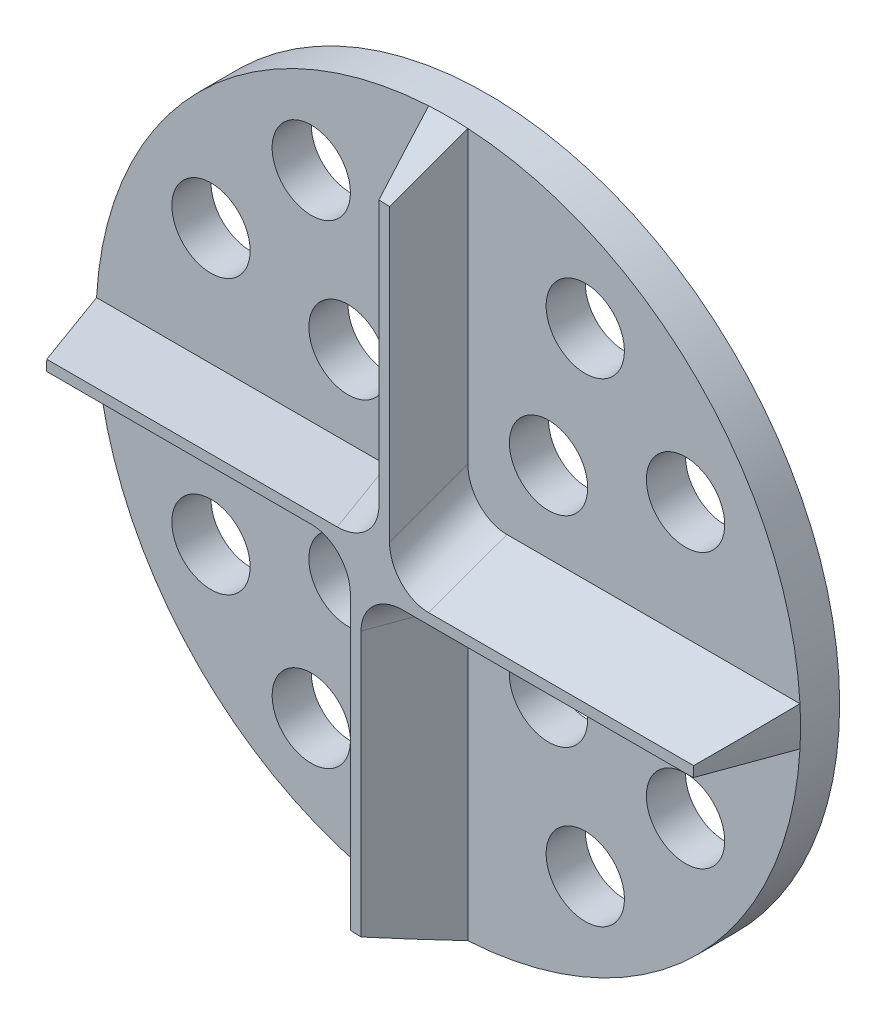
ISO-10303-21;
HEADER;
FILE_DESCRIPTION(('STEP AP214'),'2;1');
FILE_NAME('part.step','',(''),(''),'','','');
FILE_SCHEMA(('AUTOMOTIVE_DESIGN { 1 0 10303 214 1 1 1 1 }'));
ENDSEC;
DATA;
#1=APPLICATION_CONTEXT('core data for automotive mechanical design processes');
#2=APPLICATION_PROTOCOL_DEFINITION('international standard','automotive_design',2000,#1);
#3=PRODUCT_CONTEXT('',#1,'mechanical');
#4=PRODUCT('Part','Part','',(#3));
#5=PRODUCT_RELATED_PRODUCT_CATEGORY('part','',(#4));
#6=PRODUCT_DEFINITION_FORMATION('','',#4);
#7=PRODUCT_DEFINITION_CONTEXT('part definition',#1,'design');
#8=PRODUCT_DEFINITION('design','',#6,#7);
#9=PRODUCT_DEFINITION_SHAPE('','',#8);
#10=(LENGTH_UNIT() NAMED_UNIT(*) SI_UNIT(.MILLI.,.METRE.));
#11=(NAMED_UNIT(*) PLANE_ANGLE_UNIT() SI_UNIT($,.RADIAN.));
#12=(NAMED_UNIT(*) SI_UNIT($,.STERADIAN.) SOLID_ANGLE_UNIT());
#13=UNCERTAINTY_MEASURE_WITH_UNIT(LENGTH_MEASURE(1.E-05),#10,'distance_accuracy_value','');
#14=(GEOMETRIC_REPRESENTATION_CONTEXT(3) GLOBAL_UNCERTAINTY_ASSIGNED_CONTEXT((#13)) GLOBAL_UNIT_ASSIGNED_CONTEXT((#10,
#11,#12)) REPRESENTATION_CONTEXT('',''));
#15=CARTESIAN_POINT('',(0.,0.,0.));
#16=DIRECTION('',(0.,0.,1.));
#17=DIRECTION('',(1.,0.,0.));
#18=AXIS2_PLACEMENT_3D('',#15,#16,#17);
#19=CARTESIAN_POINT('',(2.5,-45.,25.));
#20=DIRECTION('',(-1.,0.,0.));
#21=DIRECTION('',(0.,0.,1.));
#22=AXIS2_PLACEMENT_3D('',#19,#20,#21);
#23=PLANE('',#22);
#24=DIRECTION('',(0.,1.,0.));
#25=VECTOR('',#24,1.);
#26=CARTESIAN_POINT('',(2.5,-45.,25.));
#27=LINE('',#26,#25);
#28=CARTESIAN_POINT('',(2.5,4.18118651971753,25.));
#29=VERTEX_POINT('',#28);
#30=CARTESIAN_POINT('',(2.5,41.284672970772,25.));
#31=VERTEX_POINT('',#30);
#32=EDGE_CURVE('E427',#29,#31,#27,.T.);
#33=ORIENTED_EDGE('',*,*,#32,.F.);
#34=DIRECTION('',(0.,0.342020143325666,-0.939692620785909));
#35=VECTOR('',#34,1.);
#36=CARTESIAN_POINT('',(2.5,-1.57191942042734,40.8065286622784));
#37=LINE('',#36,#35);
#38=CARTESIAN_POINT('',(2.5,7.82088886237953,15.));
#39=VERTEX_POINT('',#38);
#40=EDGE_CURVE('E365',#29,#39,#37,.T.);
#41=ORIENTED_EDGE('',*,*,#40,.T.);
#42=DIRECTION('',(0.,1.,0.));
#43=VECTOR('',#42,1.);
#44=CARTESIAN_POINT('',(2.5,-45.,15.));
#45=LINE('',#44,#43);
#46=CARTESIAN_POINT('',(2.5,44.9305018890285,15.));
#47=VERTEX_POINT('',#46);
#48=EDGE_CURVE('E212',#39,#47,#45,.T.);
#49=ORIENTED_EDGE('',*,*,#48,.T.);
#50=CARTESIAN_POINT('',(2.5,44.9305018890286,14.9999999999999));
#51=CARTESIAN_POINT('',(2.5,44.3229398990015,16.6666944343575));
#52=CARTESIAN_POINT('',(2.5,43.7153398274732,18.3333749848513));
#53=CARTESIAN_POINT('',(2.5,42.5000635213877,21.6667083181847));
#54=CARTESIAN_POINT('',(2.5,41.8923872868304,23.3333611010243));
#55=CARTESIAN_POINT('',(2.5,41.284672970772,25.));
#56=B_SPLINE_CURVE_WITH_KNOTS('',3,(#50,#51,#52,#53,#54,#55),.UNSPECIFIED.,.F.,.F.,(4,2,4),(0.,
5.3219373482633,10.6438746967608),.UNSPECIFIED.);
#57=EDGE_CURVE('E242',#47,#31,#56,.T.);
#58=ORIENTED_EDGE('',*,*,#57,.T.);
#59=EDGE_LOOP('',(#33,#41,#49,#58));
#60=FACE_BOUND('',#59,.T.);
#61=ADVANCED_FACE('F48',(#60),#23,.F.);
#62=CARTESIAN_POINT('',(-2.5,-45.,25.));
#63=DIRECTION('',(1.,0.,0.));
#64=DIRECTION('',(0.,0.,-1.));
#65=AXIS2_PLACEMENT_3D('',#62,#63,#64);
#66=PLANE('',#65);
#67=DIRECTION('',(0.,-1.,0.));
#68=VECTOR('',#67,1.);
#69=CARTESIAN_POINT('',(-2.5,-45.,25.));
#70=LINE('',#69,#68);
#71=CARTESIAN_POINT('',(-2.5,-4.18118651971756,25.));
#72=VERTEX_POINT('',#71);
#73=CARTESIAN_POINT('',(-2.5,-41.284672970772,25.));
#74=VERTEX_POINT('',#73);
#75=EDGE_CURVE('E223',#72,#74,#70,.T.);
#76=ORIENTED_EDGE('',*,*,#75,.F.);
#77=DIRECTION('',(0.,-0.342020143325666,-0.939692620785909));
#78=VECTOR('',#77,1.);
#79=CARTESIAN_POINT('',(-2.5,-8.95608063921851,11.8810862263844));
#80=LINE('',#79,#78);
#81=CARTESIAN_POINT('',(-2.5,-7.82088886237955,15.));
#82=VERTEX_POINT('',#81);
#83=EDGE_CURVE('E372',#72,#82,#80,.T.);
#84=ORIENTED_EDGE('',*,*,#83,.T.);
#85=DIRECTION('',(0.,-1.,0.));
#86=VECTOR('',#85,1.);
#87=CARTESIAN_POINT('',(-2.5,-45.,15.));
#88=LINE('',#87,#86);
#89=CARTESIAN_POINT('',(-2.5,-44.9305018890285,15.));
#90=VERTEX_POINT('',#89);
#91=EDGE_CURVE('E221',#82,#90,#88,.T.);
#92=ORIENTED_EDGE('',*,*,#91,.T.);
#93=CARTESIAN_POINT('',(-2.5,-44.9305018890286,14.9999999999999));
#94=CARTESIAN_POINT('',(-2.5,-44.3229398990015,16.6666944343575));
#95=CARTESIAN_POINT('',(-2.5,-43.7153398274732,18.3333749848513));
#96=CARTESIAN_POINT('',(-2.5,-42.5000635213877,21.6667083181847));
#97=CARTESIAN_POINT('',(-2.5,-41.8923872868304,23.3333611010243));
#98=CARTESIAN_POINT('',(-2.5,-41.284672970772,25.));
#99=B_SPLINE_CURVE_WITH_KNOTS('',3,(#93,#94,#95,#96,#97,#98),.UNSPECIFIED.,.F.,.F.,(4,2,4),(0.,
5.3219373482633,10.6438746967608),.UNSPECIFIED.);
#100=EDGE_CURVE('E182',#90,#74,#99,.T.);
#101=ORIENTED_EDGE('',*,*,#100,.T.);
#102=EDGE_LOOP('',(#76,#84,#92,#101));
#103=FACE_BOUND('',#102,.T.);
#104=ADVANCED_FACE('F261',(#103),#66,.F.);
#105=CARTESIAN_POINT('',(0.,-45.,25.));
#106=DIRECTION('',(0.,0.,1.));
#107=DIRECTION('',(1.,0.,0.));
#108=AXIS2_PLACEMENT_3D('',#105,#106,#107);
#109=PLANE('',#108);
#110=DIRECTION('',(-1.,0.,0.));
#111=VECTOR('',#110,1.);
#112=CARTESIAN_POINT('',(2.50000000000001,-1.13970234266203,25.));
#113=LINE('',#112,#111);
#114=CARTESIAN_POINT('',(41.3445921599636,-1.13970234266189,25.));
#115=VERTEX_POINT('',#114);
#116=CARTESIAN_POINT('',(7.50000000000002,-1.13970234266201,25.));
#117=VERTEX_POINT('',#116);
#118=EDGE_CURVE('E353',#115,#117,#113,.T.);
#119=ORIENTED_EDGE('',*,*,#118,.T.);
#120=CARTESIAN_POINT('',(7.5,4.18118651971755,25.));
#121=DIRECTION('',(0.,0.,1.));
#122=DIRECTION('',(0.,1.,0.));
#123=AXIS2_PLACEMENT_3D('',#120,#121,#122);
#124=ELLIPSE('',#123,5.32088886237956,5.);
#125=EDGE_CURVE('E355',#117,#29,#124,.F.);
#126=ORIENTED_EDGE('',*,*,#125,.T.);
#127=ORIENTED_EDGE('',*,*,#32,.T.);
#128=CARTESIAN_POINT('',(0.,0.,25.));
#129=DIRECTION('',(0.,0.,1.));
#130=DIRECTION('',(1.,0.,0.));
#131=AXIS2_PLACEMENT_3D('',#128,#129,#130);
#132=CIRCLE('',#131,41.360297657338);
#133=CARTESIAN_POINT('',(1.13970234266204,41.3445921599636,25.));
#134=VERTEX_POINT('',#133);
#135=EDGE_CURVE('E183',#31,#134,#132,.T.);
#136=ORIENTED_EDGE('',*,*,#135,.T.);
#137=DIRECTION('',(0.,-1.,0.));
#138=VECTOR('',#137,1.);
#139=CARTESIAN_POINT('',(1.13970234266204,2.49999999999999,25.));
#140=LINE('',#139,#138);
#141=CARTESIAN_POINT('',(1.13970234266204,7.49999999999999,25.));
#142=VERTEX_POINT('',#141);
#143=EDGE_CURVE('E441',#134,#142,#140,.T.);
#144=ORIENTED_EDGE('',*,*,#143,.T.);
#145=CARTESIAN_POINT('',(-4.18118651971751,7.49999999999999,25.));
#146=DIRECTION('',(0.,0.,1.));
#147=DIRECTION('',(-1.,0.,0.));
#148=AXIS2_PLACEMENT_3D('',#145,#146,#147);
#149=ELLIPSE('',#148,5.32088886237956,5.);
#150=CARTESIAN_POINT('',(-4.18118651971748,2.49999999999999,25.));
#151=VERTEX_POINT('',#150);
#152=EDGE_CURVE('E366',#142,#151,#149,.F.);
#153=ORIENTED_EDGE('',*,*,#152,.T.);
#154=DIRECTION('',(-1.,0.,0.));
#155=VECTOR('',#154,1.);
#156=CARTESIAN_POINT('',(45.,2.50000000000016,25.));
#157=LINE('',#156,#155);
#158=CARTESIAN_POINT('',(-41.284672970772,2.49999999999986,25.));
#159=VERTEX_POINT('',#158);
#160=EDGE_CURVE('E428',#151,#159,#157,.T.);
#161=ORIENTED_EDGE('',*,*,#160,.T.);
#162=CARTESIAN_POINT('',(0.,0.,25.));
#163=DIRECTION('',(0.,0.,1.));
#164=DIRECTION('',(1.,0.,0.));
#165=AXIS2_PLACEMENT_3D('',#162,#163,#164);
#166=CIRCLE('',#165,41.360297657338);
#167=CARTESIAN_POINT('',(-41.3445921599636,1.13970234266189,25.));
#168=VERTEX_POINT('',#167);
#169=EDGE_CURVE('E673',#159,#168,#166,.T.);
#170=ORIENTED_EDGE('',*,*,#169,.T.);
#171=DIRECTION('',(1.,0.,0.));
#172=VECTOR('',#171,1.);
#173=CARTESIAN_POINT('',(-2.50000000000001,1.13970234266203,25.));
#174=LINE('',#173,#172);
#175=CARTESIAN_POINT('',(-7.50000000000002,1.13970234266201,25.));
#176=VERTEX_POINT('',#175);
#177=EDGE_CURVE('E250',#168,#176,#174,.T.);
#178=ORIENTED_EDGE('',*,*,#177,.T.);
#179=CARTESIAN_POINT('',(-7.5,-4.18118651971754,25.));
#180=DIRECTION('',(0.,0.,1.));
#181=DIRECTION('',(0.,-1.,0.));
#182=AXIS2_PLACEMENT_3D('',#179,#180,#181);
#183=ELLIPSE('',#182,5.32088886237956,5.);
#184=EDGE_CURVE('E13',#176,#72,#183,.F.);
#185=ORIENTED_EDGE('',*,*,#184,.T.);
#186=ORIENTED_EDGE('',*,*,#75,.T.);
#187=CARTESIAN_POINT('',(0.,0.,25.));
#188=DIRECTION('',(0.,0.,1.));
#189=DIRECTION('',(1.,0.,0.));
#190=AXIS2_PLACEMENT_3D('',#187,#188,#189);
#191=CIRCLE('',#190,41.360297657338);
#192=CARTESIAN_POINT('',(-1.13970234266204,-41.3445921599636,25.));
#193=VERTEX_POINT('',#192);
#194=EDGE_CURVE('E358',#74,#193,#191,.T.);
#195=ORIENTED_EDGE('',*,*,#194,.T.);
#196=DIRECTION('',(0.,1.,0.));
#197=VECTOR('',#196,1.);
#198=CARTESIAN_POINT('',(-1.13970234266204,-2.49999999999999,25.));
#199=LINE('',#198,#197);
#200=CARTESIAN_POINT('',(-1.13970234266204,-7.49999999999999,25.));
#201=VERTEX_POINT('',#200);
#202=EDGE_CURVE('E426',#193,#201,#199,.T.);
#203=ORIENTED_EDGE('',*,*,#202,.T.);
#204=CARTESIAN_POINT('',(4.18118651971752,-7.49999999999999,25.));
#205=DIRECTION('',(0.,0.,1.));
#206=DIRECTION('',(1.,0.,0.));
#207=AXIS2_PLACEMENT_3D('',#204,#205,#206);
#208=ELLIPSE('',#207,5.32088886237956,5.);
#209=CARTESIAN_POINT('',(4.18118651971752,-2.49999999999999,25.));
#210=VERTEX_POINT('',#209);
#211=EDGE_CURVE('E56',#201,#210,#208,.F.);
#212=ORIENTED_EDGE('',*,*,#211,.T.);
#213=DIRECTION('',(1.,0.,0.));
#214=VECTOR('',#213,1.);
#215=CARTESIAN_POINT('',(45.,-2.49999999999985,25.));
#216=LINE('',#215,#214);
#217=CARTESIAN_POINT('',(41.284672970772,-2.49999999999986,25.));
#218=VERTEX_POINT('',#217);
#219=EDGE_CURVE('E424',#210,#218,#216,.T.);
#220=ORIENTED_EDGE('',*,*,#219,.T.);
#221=CARTESIAN_POINT('',(0.,0.,25.));
#222=DIRECTION('',(0.,0.,1.));
#223=DIRECTION('',(1.,0.,0.));
#224=AXIS2_PLACEMENT_3D('',#221,#222,#223);
#225=CIRCLE('',#224,41.360297657338);
#226=EDGE_CURVE('E181',#218,#115,#225,.T.);
#227=ORIENTED_EDGE('',*,*,#226,.T.);
#228=EDGE_LOOP('',(#119,#126,#127,#136,#144,#153,#161,#170,#178,#185,#186,#195,#203,#212,#220,#227));
#229=FACE_BOUND('',#228,.T.);
#230=ADVANCED_FACE('F344',(#229),#109,.T.);
#231=CARTESIAN_POINT('',(45.,2.50000000000016,25.));
#232=DIRECTION('',(0.,-1.,0.));
#233=DIRECTION('',(1.,0.,0.));
#234=AXIS2_PLACEMENT_3D('',#231,#232,#233);
#235=PLANE('',#234);
#236=ORIENTED_EDGE('',*,*,#160,.F.);
#237=DIRECTION('',(-0.342020143325666,0.,-0.939692620785909));
#238=VECTOR('',#237,1.);
#239=CARTESIAN_POINT('',(1.57191942042739,2.50000000000001,40.8065286622784));
#240=LINE('',#239,#238);
#241=CARTESIAN_POINT('',(-7.82088886237948,2.49999999999997,15.));
#242=VERTEX_POINT('',#241);
#243=EDGE_CURVE('E387',#151,#242,#240,.T.);
#244=ORIENTED_EDGE('',*,*,#243,.T.);
#245=DIRECTION('',(-1.,0.,0.));
#246=VECTOR('',#245,1.);
#247=CARTESIAN_POINT('',(45.,2.50000000000016,15.));
#248=LINE('',#247,#246);
#249=CARTESIAN_POINT('',(-44.9305018890286,2.49999999999984,15.));
#250=VERTEX_POINT('',#249);
#251=EDGE_CURVE('E290',#242,#250,#248,.T.);
#252=ORIENTED_EDGE('',*,*,#251,.T.);
#253=CARTESIAN_POINT('',(-44.9305018890286,2.49999999999985,14.9999999999999));
#254=CARTESIAN_POINT('',(-44.3229398990015,2.49999999999985,16.6666944343575));
#255=CARTESIAN_POINT('',(-43.7153398274732,2.49999999999985,18.3333749848513));
#256=CARTESIAN_POINT('',(-42.5000635213877,2.49999999999985,21.6667083181847));
#257=CARTESIAN_POINT('',(-41.8923872868304,2.49999999999986,23.3333611010243));
#258=CARTESIAN_POINT('',(-41.284672970772,2.49999999999986,25.));
#259=B_SPLINE_CURVE_WITH_KNOTS('',3,(#253,#254,#255,#256,#257,#258),.UNSPECIFIED.,.F.,.F.,(4,2,
4),(0.,5.32193734826329,10.6438746967608),.UNSPECIFIED.);
#260=EDGE_CURVE('E292',#250,#159,#259,.T.);
#261=ORIENTED_EDGE('',*,*,#260,.T.);
#262=EDGE_LOOP('',(#236,#244,#252,#261));
#263=FACE_BOUND('',#262,.T.);
#264=ADVANCED_FACE('F339',(#263),#235,.F.);
#265=CARTESIAN_POINT('',(45.,-2.49999999999985,25.));
#266=DIRECTION('',(0.,1.,0.));
#267=DIRECTION('',(-1.,0.,0.));
#268=AXIS2_PLACEMENT_3D('',#265,#266,#267);
#269=PLANE('',#268);
#270=ORIENTED_EDGE('',*,*,#219,.F.);
#271=DIRECTION('',(0.342020143325666,0.,-0.939692620785909));
#272=VECTOR('',#271,1.);
#273=CARTESIAN_POINT('',(8.95608063921846,-2.49999999999997,11.8810862263843));
#274=LINE('',#273,#272);
#275=CARTESIAN_POINT('',(7.82088886237951,-2.49999999999997,15.));
#276=VERTEX_POINT('',#275);
#277=EDGE_CURVE('E169',#210,#276,#274,.T.);
#278=ORIENTED_EDGE('',*,*,#277,.T.);
#279=DIRECTION('',(1.,0.,0.));
#280=VECTOR('',#279,1.);
#281=CARTESIAN_POINT('',(45.,-2.49999999999985,15.));
#282=LINE('',#281,#280);
#283=CARTESIAN_POINT('',(44.9305018890286,-2.49999999999985,15.));
#284=VERTEX_POINT('',#283);
#285=EDGE_CURVE('E162',#276,#284,#282,.T.);
#286=ORIENTED_EDGE('',*,*,#285,.T.);
#287=CARTESIAN_POINT('',(44.9305018890286,-2.49999999999985,14.9999999999999));
#288=CARTESIAN_POINT('',(44.3229398990015,-2.49999999999985,16.6666944343575));
#289=CARTESIAN_POINT('',(43.7153398274732,-2.49999999999985,18.3333749848513));
#290=CARTESIAN_POINT('',(42.5000635213877,-2.49999999999985,21.6667083181847));
#291=CARTESIAN_POINT('',(41.8923872868304,-2.49999999999986,23.3333611010243));
#292=CARTESIAN_POINT('',(41.284672970772,-2.49999999999986,25.));
#293=B_SPLINE_CURVE_WITH_KNOTS('',3,(#287,#288,#289,#290,#291,#292),.UNSPECIFIED.,.F.,.F.,(4,2,
4),(0.,5.32193734826329,10.6438746967608),.UNSPECIFIED.);
#294=EDGE_CURVE('E166',#284,#218,#293,.T.);
#295=ORIENTED_EDGE('',*,*,#294,.T.);
#296=EDGE_LOOP('',(#270,#278,#286,#295));
#297=FACE_BOUND('',#296,.T.);
#298=ADVANCED_FACE('F165',(#297),#269,.F.);
#299=CARTESIAN_POINT('',(0.,0.,15.));
#300=DIRECTION('',(0.,0.,1.));
#301=DIRECTION('',(1.,0.,0.));
#302=AXIS2_PLACEMENT_3D('',#299,#300,#301);
#303=PLANE('',#302);
#304=CARTESIAN_POINT('',(-30.3108891324553,17.5,15.));
#305=DIRECTION('',(0.,0.,1.));
#306=DIRECTION('',(1.,0.,0.));
#307=AXIS2_PLACEMENT_3D('',#304,#305,#306);
#308=CIRCLE('',#307,5.);
#309=CARTESIAN_POINT('',(-25.3108891324553,17.5,15.));
#310=VERTEX_POINT('',#309);
#311=EDGE_CURVE('E652',#310,#310,#308,.T.);
#312=ORIENTED_EDGE('',*,*,#311,.F.);
#313=EDGE_LOOP('',(#312));
#314=FACE_BOUND('',#313,.T.);
#315=CARTESIAN_POINT('',(-17.4999999999999,30.3108891324554,15.));
#316=DIRECTION('',(0.,0.,1.));
#317=DIRECTION('',(1.,0.,0.));
#318=AXIS2_PLACEMENT_3D('',#315,#316,#317);
#319=CIRCLE('',#318,5.);
#320=CARTESIAN_POINT('',(-12.4999999999999,30.3108891324554,15.));
#321=VERTEX_POINT('',#320);
#322=EDGE_CURVE('E655',#321,#321,#319,.T.);
#323=ORIENTED_EDGE('',*,*,#322,.F.);
#324=EDGE_LOOP('',(#323));
#325=FACE_BOUND('',#324,.T.);
#326=CARTESIAN_POINT('',(-12.8108891324553,12.8108891324553,15.));
#327=DIRECTION('',(0.,0.,1.));
#328=DIRECTION('',(1.,0.,0.));
#329=AXIS2_PLACEMENT_3D('',#326,#327,#328);
#330=CIRCLE('',#329,4.99999999999997);
#331=CARTESIAN_POINT('',(-7.81088913245533,12.8108891324553,15.));
#332=VERTEX_POINT('',#331);
#333=EDGE_CURVE('E661',#332,#332,#330,.T.);
#334=ORIENTED_EDGE('',*,*,#333,.F.);
#335=EDGE_LOOP('',(#334));
#336=FACE_BOUND('',#335,.T.);
#337=ORIENTED_EDGE('',*,*,#251,.F.);
#338=CARTESIAN_POINT('',(-7.82088886237951,7.49999999999997,15.));
#339=DIRECTION('',(0.,0.,1.));
#340=DIRECTION('',(-1.,0.,0.));
#341=AXIS2_PLACEMENT_3D('',#338,#339,#340);
#342=ELLIPSE('',#341,5.32088886237956,5.);
#343=CARTESIAN_POINT('',(-2.5,7.49999999999997,15.));
#344=VERTEX_POINT('',#343);
#345=EDGE_CURVE('E385',#242,#344,#342,.T.);
#346=ORIENTED_EDGE('',*,*,#345,.T.);
#347=CARTESIAN_POINT('',(-2.5,44.9305018890286,15.));
#348=VERTEX_POINT('',#347);
#349=EDGE_CURVE('E225',#348,#344,#88,.T.);
#350=ORIENTED_EDGE('',*,*,#349,.F.);
#351=CARTESIAN_POINT('',(0.,0.,15.));
#352=DIRECTION('',(0.,0.,1.));
#353=DIRECTION('',(1.,0.,0.));
#354=AXIS2_PLACEMENT_3D('',#351,#352,#353);
#355=CIRCLE('',#354,45.);
#356=EDGE_CURVE('E206',#348,#250,#355,.T.);
#357=ORIENTED_EDGE('',*,*,#356,.T.);
#358=EDGE_LOOP('',(#337,#346,#350,#357));
#359=FACE_BOUND('',#358,.T.);
#360=ADVANCED_FACE('F264',(#314,#325,#336,#359),#303,.T.);
#361=CARTESIAN_POINT('',(-30.3108891324553,-17.5,15.));
#362=DIRECTION('',(0.,0.,1.));
#363=DIRECTION('',(0.,1.,0.));
#364=AXIS2_PLACEMENT_3D('',#361,#362,#363);
#365=CIRCLE('',#364,5.);
#366=CARTESIAN_POINT('',(-30.3108891324553,-12.5,15.));
#367=VERTEX_POINT('',#366);
#368=EDGE_CURVE('E618',#367,#367,#365,.T.);
#369=ORIENTED_EDGE('',*,*,#368,.F.);
#370=EDGE_LOOP('',(#369));
#371=FACE_BOUND('',#370,.T.);
#372=CARTESIAN_POINT('',(-12.8108891324553,-12.8108891324553,15.));
#373=DIRECTION('',(0.,0.,1.));
#374=DIRECTION('',(0.,1.,0.));
#375=AXIS2_PLACEMENT_3D('',#372,#373,#374);
#376=CIRCLE('',#375,4.99999999999997);
#377=CARTESIAN_POINT('',(-12.8108891324553,-7.81088913245538,15.));
#378=VERTEX_POINT('',#377);
#379=EDGE_CURVE('E625',#378,#378,#376,.T.);
#380=ORIENTED_EDGE('',*,*,#379,.F.);
#381=EDGE_LOOP('',(#380));
#382=FACE_BOUND('',#381,.T.);
#383=CARTESIAN_POINT('',(-17.4999999999999,-30.3108891324554,15.));
#384=DIRECTION('',(0.,0.,1.));
#385=DIRECTION('',(0.,1.,0.));
#386=AXIS2_PLACEMENT_3D('',#383,#384,#385);
#387=CIRCLE('',#386,5.);
#388=CARTESIAN_POINT('',(-17.4999999999999,-25.3108891324554,15.));
#389=VERTEX_POINT('',#388);
#390=EDGE_CURVE('E622',#389,#389,#387,.T.);
#391=ORIENTED_EDGE('',*,*,#390,.F.);
#392=EDGE_LOOP('',(#391));
#393=FACE_BOUND('',#392,.T.);
#394=ORIENTED_EDGE('',*,*,#91,.F.);
#395=CARTESIAN_POINT('',(-7.5,-7.82088886237954,15.));
#396=DIRECTION('',(0.,0.,1.));
#397=DIRECTION('',(0.,-1.,0.));
#398=AXIS2_PLACEMENT_3D('',#395,#396,#397);
#399=ELLIPSE('',#398,5.32088886237956,5.);
#400=CARTESIAN_POINT('',(-7.50000000000001,-2.50000000000003,15.));
#401=VERTEX_POINT('',#400);
#402=EDGE_CURVE('E71',#82,#401,#399,.T.);
#403=ORIENTED_EDGE('',*,*,#402,.T.);
#404=CARTESIAN_POINT('',(-44.9305018890286,-2.50000000000016,15.));
#405=VERTEX_POINT('',#404);
#406=EDGE_CURVE('E172',#405,#401,#282,.T.);
#407=ORIENTED_EDGE('',*,*,#406,.F.);
#408=EDGE_CURVE('E204',#405,#90,#355,.T.);
#409=ORIENTED_EDGE('',*,*,#408,.T.);
#410=EDGE_LOOP('',(#394,#403,#407,#409));
#411=FACE_BOUND('',#410,.T.);
#412=ADVANCED_FACE('F267',(#371,#382,#393,#411),#303,.T.);
#413=CARTESIAN_POINT('',(12.8108891324552,12.8108891324554,15.));
#414=DIRECTION('',(0.,0.,1.));
#415=DIRECTION('',(0.,-1.,0.));
#416=AXIS2_PLACEMENT_3D('',#413,#414,#415);
#417=CIRCLE('',#416,4.99999999999997);
#418=CARTESIAN_POINT('',(12.8108891324553,7.81088913245546,15.));
#419=VERTEX_POINT('',#418);
#420=EDGE_CURVE('E702',#419,#419,#417,.T.);
#421=ORIENTED_EDGE('',*,*,#420,.F.);
#422=EDGE_LOOP('',(#421));
#423=FACE_BOUND('',#422,.T.);
#424=CARTESIAN_POINT('',(30.3108891324552,17.5000000000003,15.));
#425=DIRECTION('',(0.,0.,1.));
#426=DIRECTION('',(0.,-1.,0.));
#427=AXIS2_PLACEMENT_3D('',#424,#425,#426);
#428=CIRCLE('',#427,5.);
#429=CARTESIAN_POINT('',(30.3108891324553,12.5000000000003,15.));
#430=VERTEX_POINT('',#429);
#431=EDGE_CURVE('E706',#430,#430,#428,.T.);
#432=ORIENTED_EDGE('',*,*,#431,.F.);
#433=EDGE_LOOP('',(#432));
#434=FACE_BOUND('',#433,.T.);
#435=CARTESIAN_POINT('',(17.4999999999997,30.3108891324555,15.));
#436=DIRECTION('',(0.,0.,1.));
#437=DIRECTION('',(0.,-1.,0.));
#438=AXIS2_PLACEMENT_3D('',#435,#436,#437);
#439=CIRCLE('',#438,5.);
#440=CARTESIAN_POINT('',(17.4999999999998,25.3108891324555,15.));
#441=VERTEX_POINT('',#440);
#442=EDGE_CURVE('E709',#441,#441,#439,.T.);
#443=ORIENTED_EDGE('',*,*,#442,.F.);
#444=EDGE_LOOP('',(#443));
#445=FACE_BOUND('',#444,.T.);
#446=ORIENTED_EDGE('',*,*,#48,.F.);
#447=CARTESIAN_POINT('',(7.5,7.82088886237954,15.));
#448=DIRECTION('',(0.,0.,1.));
#449=DIRECTION('',(0.,1.,0.));
#450=AXIS2_PLACEMENT_3D('',#447,#448,#449);
#451=ELLIPSE('',#450,5.32088886237956,5.);
#452=CARTESIAN_POINT('',(7.50000000000003,2.50000000000003,15.));
#453=VERTEX_POINT('',#452);
#454=EDGE_CURVE('E380',#39,#453,#451,.T.);
#455=ORIENTED_EDGE('',*,*,#454,.T.);
#456=CARTESIAN_POINT('',(44.9305018890286,2.50000000000016,15.));
#457=VERTEX_POINT('',#456);
#458=EDGE_CURVE('E173',#457,#453,#248,.T.);
#459=ORIENTED_EDGE('',*,*,#458,.F.);
#460=EDGE_CURVE('E196',#457,#47,#355,.T.);
#461=ORIENTED_EDGE('',*,*,#460,.T.);
#462=EDGE_LOOP('',(#446,#455,#459,#461));
#463=FACE_BOUND('',#462,.T.);
#464=ADVANCED_FACE('F437',(#423,#434,#445,#463),#303,.T.);
#465=CARTESIAN_POINT('',(30.3108891324553,-17.5,15.));
#466=DIRECTION('',(0.,0.,1.));
#467=DIRECTION('',(-1.,0.,0.));
#468=AXIS2_PLACEMENT_3D('',#465,#466,#467);
#469=CIRCLE('',#468,5.);
#470=CARTESIAN_POINT('',(25.3108891324553,-17.5,15.));
#471=VERTEX_POINT('',#470);
#472=EDGE_CURVE('E634',#471,#471,#469,.T.);
#473=ORIENTED_EDGE('',*,*,#472,.F.);
#474=EDGE_LOOP('',(#473));
#475=FACE_BOUND('',#474,.T.);
#476=CARTESIAN_POINT('',(17.4999999999999,-30.3108891324554,15.));
#477=DIRECTION('',(0.,0.,1.));
#478=DIRECTION('',(-1.,0.,0.));
#479=AXIS2_PLACEMENT_3D('',#476,#477,#478);
#480=CIRCLE('',#479,5.);
#481=CARTESIAN_POINT('',(12.4999999999999,-30.3108891324554,15.));
#482=VERTEX_POINT('',#481);
#483=EDGE_CURVE('E640',#482,#482,#480,.T.);
#484=ORIENTED_EDGE('',*,*,#483,.F.);
#485=EDGE_LOOP('',(#484));
#486=FACE_BOUND('',#485,.T.);
#487=CARTESIAN_POINT('',(12.8108891324553,-12.8108891324553,15.));
#488=DIRECTION('',(0.,0.,1.));
#489=DIRECTION('',(-1.,0.,0.));
#490=AXIS2_PLACEMENT_3D('',#487,#488,#489);
#491=CIRCLE('',#490,4.99999999999997);
#492=CARTESIAN_POINT('',(7.81088913245533,-12.8108891324553,15.));
#493=VERTEX_POINT('',#492);
#494=EDGE_CURVE('E714',#493,#493,#491,.T.);
#495=ORIENTED_EDGE('',*,*,#494,.F.);
#496=EDGE_LOOP('',(#495));
#497=FACE_BOUND('',#496,.T.);
#498=ORIENTED_EDGE('',*,*,#285,.F.);
#499=CARTESIAN_POINT('',(7.82088886237951,-7.49999999999998,15.));
#500=DIRECTION('',(0.,0.,1.));
#501=DIRECTION('',(1.,0.,0.));
#502=AXIS2_PLACEMENT_3D('',#499,#500,#501);
#503=ELLIPSE('',#502,5.32088886237956,5.);
#504=CARTESIAN_POINT('',(2.5,-7.49999999999999,15.));
#505=VERTEX_POINT('',#504);
#506=EDGE_CURVE('E376',#276,#505,#503,.T.);
#507=ORIENTED_EDGE('',*,*,#506,.T.);
#508=CARTESIAN_POINT('',(2.5,-44.9305018890286,15.));
#509=VERTEX_POINT('',#508);
#510=EDGE_CURVE('E203',#509,#505,#45,.T.);
#511=ORIENTED_EDGE('',*,*,#510,.F.);
#512=EDGE_CURVE('E192',#509,#284,#355,.T.);
#513=ORIENTED_EDGE('',*,*,#512,.T.);
#514=EDGE_LOOP('',(#498,#507,#511,#513));
#515=FACE_BOUND('',#514,.T.);
#516=ADVANCED_FACE('F201',(#475,#486,#497,#515),#303,.T.);
#517=CARTESIAN_POINT('',(0.,0.,15.));
#518=DIRECTION('',(0.,0.,-1.));
#519=DIRECTION('',(-1.,0.,0.));
#520=AXIS2_PLACEMENT_3D('',#517,#518,#519);
#521=CYLINDRICAL_SURFACE('',#520,45.);
#522=ORIENTED_EDGE('',*,*,#356,.F.);
#523=CARTESIAN_POINT('',(0.,0.,14.9999999999999));
#524=DIRECTION('',(0.,0.,1.));
#525=DIRECTION('',(1.,0.,0.));
#526=AXIS2_PLACEMENT_3D('',#523,#524,#525);
#527=CIRCLE('',#526,45.);
#528=EDGE_CURVE('E198',#348,#47,#527,.F.);
#529=ORIENTED_EDGE('',*,*,#528,.T.);
#530=ORIENTED_EDGE('',*,*,#460,.F.);
#531=CARTESIAN_POINT('',(0.,0.,14.9999999999999));
#532=DIRECTION('',(0.,0.,1.));
#533=DIRECTION('',(1.,0.,0.));
#534=AXIS2_PLACEMENT_3D('',#531,#532,#533);
#535=CIRCLE('',#534,45.);
#536=EDGE_CURVE('E180',#457,#284,#535,.F.);
#537=ORIENTED_EDGE('',*,*,#536,.T.);
#538=ORIENTED_EDGE('',*,*,#512,.F.);
#539=CARTESIAN_POINT('',(0.,0.,14.9999999999999));
#540=DIRECTION('',(0.,0.,1.));
#541=DIRECTION('',(1.,0.,0.));
#542=AXIS2_PLACEMENT_3D('',#539,#540,#541);
#543=CIRCLE('',#542,45.);
#544=EDGE_CURVE('E199',#509,#90,#543,.F.);
#545=ORIENTED_EDGE('',*,*,#544,.T.);
#546=ORIENTED_EDGE('',*,*,#408,.F.);
#547=CARTESIAN_POINT('',(0.,0.,14.9999999999999));
#548=DIRECTION('',(0.,0.,1.));
#549=DIRECTION('',(1.,0.,0.));
#550=AXIS2_PLACEMENT_3D('',#547,#548,#549);
#551=CIRCLE('',#550,45.);
#552=EDGE_CURVE('E231',#405,#250,#551,.F.);
#553=ORIENTED_EDGE('',*,*,#552,.T.);
#554=EDGE_LOOP('',(#522,#529,#530,#537,#538,#545,#546,#553));
#555=FACE_BOUND('',#554,.T.);
#556=CARTESIAN_POINT('',(0.,0.,10.));
#557=DIRECTION('',(0.,0.,1.));
#558=DIRECTION('',(1.,0.,0.));
#559=AXIS2_PLACEMENT_3D('',#556,#557,#558);
#560=CIRCLE('',#559,45.);
#561=CARTESIAN_POINT('',(45.,0.,10.));
#562=VERTEX_POINT('',#561);
#563=EDGE_CURVE('E208',#562,#562,#560,.T.);
#564=ORIENTED_EDGE('',*,*,#563,.T.);
#565=EDGE_LOOP('',(#564));
#566=FACE_BOUND('',#565,.T.);
#567=ADVANCED_FACE('F189',(#555,#566),#521,.T.);
#568=CARTESIAN_POINT('',(0.,0.,10.));
#569=DIRECTION('',(0.,0.,1.));
#570=DIRECTION('',(1.,0.,0.));
#571=AXIS2_PLACEMENT_3D('',#568,#569,#570);
#572=PLANE('',#571);
#573=CARTESIAN_POINT('',(-30.3108891324553,-17.5,10.));
#574=DIRECTION('',(0.,0.,1.));
#575=DIRECTION('',(0.,1.,0.));
#576=AXIS2_PLACEMENT_3D('',#573,#574,#575);
#577=CIRCLE('',#576,5.);
#578=CARTESIAN_POINT('',(-30.3108891324553,-12.5,10.));
#579=VERTEX_POINT('',#578);
#580=EDGE_CURVE('E615',#579,#579,#577,.T.);
#581=ORIENTED_EDGE('',*,*,#580,.T.);
#582=EDGE_LOOP('',(#581));
#583=FACE_BOUND('',#582,.T.);
#584=CARTESIAN_POINT('',(-12.8108891324553,-12.8108891324553,10.));
#585=DIRECTION('',(0.,0.,1.));
#586=DIRECTION('',(0.,1.,0.));
#587=AXIS2_PLACEMENT_3D('',#584,#585,#586);
#588=CIRCLE('',#587,4.99999999999997);
#589=CARTESIAN_POINT('',(-12.8108891324553,-7.81088913245538,10.));
#590=VERTEX_POINT('',#589);
#591=EDGE_CURVE('E620',#590,#590,#588,.T.);
#592=ORIENTED_EDGE('',*,*,#591,.T.);
#593=EDGE_LOOP('',(#592));
#594=FACE_BOUND('',#593,.T.);
#595=CARTESIAN_POINT('',(30.3108891324553,-17.5,10.));
#596=DIRECTION('',(0.,0.,1.));
#597=DIRECTION('',(-1.,0.,0.));
#598=AXIS2_PLACEMENT_3D('',#595,#596,#597);
#599=CIRCLE('',#598,5.);
#600=CARTESIAN_POINT('',(25.3108891324553,-17.5,10.));
#601=VERTEX_POINT('',#600);
#602=EDGE_CURVE('E631',#601,#601,#599,.T.);
#603=ORIENTED_EDGE('',*,*,#602,.T.);
#604=EDGE_LOOP('',(#603));
#605=FACE_BOUND('',#604,.T.);
#606=CARTESIAN_POINT('',(17.4999999999999,-30.3108891324554,10.));
#607=DIRECTION('',(0.,0.,1.));
#608=DIRECTION('',(-1.,0.,0.));
#609=AXIS2_PLACEMENT_3D('',#606,#607,#608);
#610=CIRCLE('',#609,5.);
#611=CARTESIAN_POINT('',(12.4999999999999,-30.3108891324554,10.));
#612=VERTEX_POINT('',#611);
#613=EDGE_CURVE('E637',#612,#612,#610,.T.);
#614=ORIENTED_EDGE('',*,*,#613,.T.);
#615=EDGE_LOOP('',(#614));
#616=FACE_BOUND('',#615,.T.);
#617=CARTESIAN_POINT('',(12.8108891324552,12.8108891324554,10.));
#618=DIRECTION('',(0.,0.,1.));
#619=DIRECTION('',(0.,-1.,0.));
#620=AXIS2_PLACEMENT_3D('',#617,#618,#619);
#621=CIRCLE('',#620,4.99999999999997);
#622=CARTESIAN_POINT('',(12.8108891324553,7.81088913245546,10.));
#623=VERTEX_POINT('',#622);
#624=EDGE_CURVE('E724',#623,#623,#621,.T.);
#625=ORIENTED_EDGE('',*,*,#624,.T.);
#626=EDGE_LOOP('',(#625));
#627=FACE_BOUND('',#626,.T.);
#628=CARTESIAN_POINT('',(30.3108891324552,17.5000000000003,10.));
#629=DIRECTION('',(0.,0.,1.));
#630=DIRECTION('',(0.,-1.,0.));
#631=AXIS2_PLACEMENT_3D('',#628,#629,#630);
#632=CIRCLE('',#631,5.);
#633=CARTESIAN_POINT('',(30.3108891324553,12.5000000000003,10.));
#634=VERTEX_POINT('',#633);
#635=EDGE_CURVE('E712',#634,#634,#632,.T.);
#636=ORIENTED_EDGE('',*,*,#635,.T.);
#637=EDGE_LOOP('',(#636));
#638=FACE_BOUND('',#637,.T.);
#639=CARTESIAN_POINT('',(17.4999999999997,30.3108891324555,10.));
#640=DIRECTION('',(0.,0.,1.));
#641=DIRECTION('',(0.,-1.,0.));
#642=AXIS2_PLACEMENT_3D('',#639,#640,#641);
#643=CIRCLE('',#642,5.);
#644=CARTESIAN_POINT('',(17.4999999999998,25.3108891324555,10.));
#645=VERTEX_POINT('',#644);
#646=EDGE_CURVE('E711',#645,#645,#643,.T.);
#647=ORIENTED_EDGE('',*,*,#646,.T.);
#648=EDGE_LOOP('',(#647));
#649=FACE_BOUND('',#648,.T.);
#650=CARTESIAN_POINT('',(12.8108891324553,-12.8108891324553,10.));
#651=DIRECTION('',(0.,0.,1.));
#652=DIRECTION('',(-1.,0.,0.));
#653=AXIS2_PLACEMENT_3D('',#650,#651,#652);
#654=CIRCLE('',#653,4.99999999999997);
#655=CARTESIAN_POINT('',(7.81088913245533,-12.8108891324553,10.));
#656=VERTEX_POINT('',#655);
#657=EDGE_CURVE('E643',#656,#656,#654,.T.);
#658=ORIENTED_EDGE('',*,*,#657,.T.);
#659=EDGE_LOOP('',(#658));
#660=FACE_BOUND('',#659,.T.);
#661=CARTESIAN_POINT('',(-17.4999999999999,-30.3108891324554,10.));
#662=DIRECTION('',(0.,0.,1.));
#663=DIRECTION('',(0.,1.,0.));
#664=AXIS2_PLACEMENT_3D('',#661,#662,#663);
#665=CIRCLE('',#664,5.);
#666=CARTESIAN_POINT('',(-17.4999999999999,-25.3108891324554,10.));
#667=VERTEX_POINT('',#666);
#668=EDGE_CURVE('E644',#667,#667,#665,.T.);
#669=ORIENTED_EDGE('',*,*,#668,.T.);
#670=EDGE_LOOP('',(#669));
#671=FACE_BOUND('',#670,.T.);
#672=CARTESIAN_POINT('',(-30.3108891324553,17.5,10.));
#673=DIRECTION('',(0.,0.,1.));
#674=DIRECTION('',(1.,0.,0.));
#675=AXIS2_PLACEMENT_3D('',#672,#673,#674);
#676=CIRCLE('',#675,5.);
#677=CARTESIAN_POINT('',(-25.3108891324553,17.5,10.));
#678=VERTEX_POINT('',#677);
#679=EDGE_CURVE('E396',#678,#678,#676,.T.);
#680=ORIENTED_EDGE('',*,*,#679,.T.);
#681=EDGE_LOOP('',(#680));
#682=FACE_BOUND('',#681,.T.);
#683=CARTESIAN_POINT('',(-17.4999999999999,30.3108891324554,10.));
#684=DIRECTION('',(0.,0.,1.));
#685=DIRECTION('',(1.,0.,0.));
#686=AXIS2_PLACEMENT_3D('',#683,#684,#685);
#687=CIRCLE('',#686,5.);
#688=CARTESIAN_POINT('',(-12.4999999999999,30.3108891324554,10.));
#689=VERTEX_POINT('',#688);
#690=EDGE_CURVE('E658',#689,#689,#687,.T.);
#691=ORIENTED_EDGE('',*,*,#690,.T.);
#692=EDGE_LOOP('',(#691));
#693=FACE_BOUND('',#692,.T.);
#694=CARTESIAN_POINT('',(-12.8108891324553,12.8108891324553,10.));
#695=DIRECTION('',(0.,0.,1.));
#696=DIRECTION('',(1.,0.,0.));
#697=AXIS2_PLACEMENT_3D('',#694,#695,#696);
#698=CIRCLE('',#697,4.99999999999997);
#699=CARTESIAN_POINT('',(-7.81088913245533,12.8108891324553,10.));
#700=VERTEX_POINT('',#699);
#701=EDGE_CURVE('E647',#700,#700,#698,.T.);
#702=ORIENTED_EDGE('',*,*,#701,.T.);
#703=EDGE_LOOP('',(#702));
#704=FACE_BOUND('',#703,.T.);
#705=ORIENTED_EDGE('',*,*,#563,.F.);
#706=EDGE_LOOP('',(#705));
#707=FACE_BOUND('',#706,.T.);
#708=ADVANCED_FACE('F269',(#583,#594,#605,#616,#627,#638,#649,#660,#671,#682,#693,#704,#707),
#572,.F.);
#709=CARTESIAN_POINT('',(1.13970234266204,-45.,25.));
#710=DIRECTION('',(-0.939692620785909,0.,0.342020143325666));
#711=DIRECTION('',(0.,1.,0.));
#712=AXIS2_PLACEMENT_3D('',#709,#710,#711);
#713=PLANE('',#712);
#714=ORIENTED_EDGE('',*,*,#349,.T.);
#715=DIRECTION('',(-0.342020143325666,0.,-0.939692620785909));
#716=VECTOR('',#715,1.);
#717=CARTESIAN_POINT('',(1.13970234266202,7.49999999999999,24.9999999999999));
#718=LINE('',#717,#716);
#719=EDGE_CURVE('E383',#344,#142,#718,.F.);
#720=ORIENTED_EDGE('',*,*,#719,.T.);
#721=ORIENTED_EDGE('',*,*,#143,.F.);
#722=CARTESIAN_POINT('',(1.13970234266204,41.3445921599636,25.));
#723=CARTESIAN_POINT('',(0.837739121025737,41.6549878846637,24.1703628670485));
#724=CARTESIAN_POINT('',(0.535403942079902,41.9622826858918,23.339703789788));
#725=CARTESIAN_POINT('',(-0.0699464405369288,42.5709783699743,21.6765172826901));
#726=CARTESIAN_POINT('',(-0.372961616846475,42.8723794853989,20.8439899280275));
#727=CARTESIAN_POINT('',(-0.979630645770095,43.4696188968769,19.1771804699774));
#728=CARTESIAN_POINT('',(-1.28328449554312,43.7654572176177,18.3428983743955));
#729=CARTESIAN_POINT('',(-1.89120021090554,44.3518645761546,16.6726636735057));
#730=CARTESIAN_POINT('',(-2.19546210005954,44.6424334051554,15.8367110034544));
#731=CARTESIAN_POINT('',(-2.5,44.9305018890286,14.9999999999999));
#732=B_SPLINE_CURVE_WITH_KNOTS('',3,(#722,#723,#724,#725,#726,#727,#728,#729,#730,#731),
.UNSPECIFIED.,.F.,.F.,(4,2,2,2,4),(0.,2.80755638218053,5.6150017511966,8.42243465796838,
11.2299785629193),.UNSPECIFIED.);
#733=EDGE_CURVE('E282',#348,#134,#732,.F.);
#734=ORIENTED_EDGE('',*,*,#733,.F.);
#735=EDGE_LOOP('',(#714,#720,#721,#734));
#736=FACE_BOUND('',#735,.T.);
#737=ADVANCED_FACE('F272',(#736),#713,.T.);
#738=CARTESIAN_POINT('',(0.,0.,14.9999999999999));
#739=DIRECTION('',(0.,0.,-1.));
#740=DIRECTION('',(-1.,0.,0.));
#741=AXIS2_PLACEMENT_3D('',#738,#739,#740);
#742=CONICAL_SURFACE('',#741,45.,0.349065850398863);
#743=ORIENTED_EDGE('',*,*,#733,.T.);
#744=ORIENTED_EDGE('',*,*,#135,.F.);
#745=ORIENTED_EDGE('',*,*,#57,.F.);
#746=ORIENTED_EDGE('',*,*,#528,.F.);
#747=EDGE_LOOP('',(#743,#744,#745,#746));
#748=FACE_BOUND('',#747,.T.);
#749=ADVANCED_FACE('F253',(#748),#742,.T.);
#750=CARTESIAN_POINT('',(-1.53137410786701E-13,-1.13970234266204,25.));
#751=DIRECTION('',(0.,0.939692620785909,0.342020143325666));
#752=DIRECTION('',(1.,0.,0.));
#753=AXIS2_PLACEMENT_3D('',#750,#751,#752);
#754=PLANE('',#753);
#755=ORIENTED_EDGE('',*,*,#458,.T.);
#756=DIRECTION('',(0.,0.342020143325666,-0.939692620785909));
#757=VECTOR('',#756,1.);
#758=CARTESIAN_POINT('',(7.50000000000002,-1.13970234266201,25.));
#759=LINE('',#758,#757);
#760=EDGE_CURVE('E364',#453,#117,#759,.F.);
#761=ORIENTED_EDGE('',*,*,#760,.T.);
#762=ORIENTED_EDGE('',*,*,#118,.F.);
#763=CARTESIAN_POINT('',(41.3445921599636,-1.13970234266189,25.));
#764=CARTESIAN_POINT('',(41.6549878846637,-0.837739121025591,24.1703628670485));
#765=CARTESIAN_POINT('',(41.9622826858918,-0.535403942079756,23.339703789788));
#766=CARTESIAN_POINT('',(42.5709783699743,0.0699464405370776,21.6765172826901));
#767=CARTESIAN_POINT('',(42.8723794853989,0.372961616846625,20.8439899280275));
#768=CARTESIAN_POINT('',(43.4696188968769,0.979630645770248,19.1771804699774));
#769=CARTESIAN_POINT('',(43.7654572176176,1.28328449554327,18.3428983743955));
#770=CARTESIAN_POINT('',(44.3518645761546,1.89120021090569,16.6726636735057));
#771=CARTESIAN_POINT('',(44.6424334051554,2.1954621000597,15.8367110034544));
#772=CARTESIAN_POINT('',(44.9305018890286,2.50000000000016,14.9999999999999));
#773=B_SPLINE_CURVE_WITH_KNOTS('',3,(#763,#764,#765,#766,#767,#768,#769,#770,#771,#772),
.UNSPECIFIED.,.F.,.F.,(4,2,2,2,4),(0.,2.80755638218053,5.6150017511966,8.42243465796838,
11.2299785629193),.UNSPECIFIED.);
#774=EDGE_CURVE('E291',#457,#115,#773,.F.);
#775=ORIENTED_EDGE('',*,*,#774,.F.);
#776=EDGE_LOOP('',(#755,#761,#762,#775));
#777=FACE_BOUND('',#776,.T.);
#778=ADVANCED_FACE('F315',(#777),#754,.T.);
#779=CARTESIAN_POINT('',(0.,0.,14.9999999999999));
#780=DIRECTION('',(0.,0.,-1.));
#781=DIRECTION('',(-1.,0.,0.));
#782=AXIS2_PLACEMENT_3D('',#779,#780,#781);
#783=CONICAL_SURFACE('',#782,45.,0.349065850398863);
#784=ORIENTED_EDGE('',*,*,#774,.T.);
#785=ORIENTED_EDGE('',*,*,#226,.F.);
#786=ORIENTED_EDGE('',*,*,#294,.F.);
#787=ORIENTED_EDGE('',*,*,#536,.F.);
#788=EDGE_LOOP('',(#784,#785,#786,#787));
#789=FACE_BOUND('',#788,.T.);
#790=ADVANCED_FACE('F179',(#789),#783,.T.);
#791=CARTESIAN_POINT('',(-1.13970234266204,-45.,25.));
#792=DIRECTION('',(0.939692620785909,0.,0.342020143325666));
#793=DIRECTION('',(0.,-1.,0.));
#794=AXIS2_PLACEMENT_3D('',#791,#792,#793);
#795=PLANE('',#794);
#796=ORIENTED_EDGE('',*,*,#510,.T.);
#797=DIRECTION('',(0.342020143325666,0.,-0.939692620785909));
#798=VECTOR('',#797,1.);
#799=CARTESIAN_POINT('',(-1.13970234266205,-7.49999999999999,25.));
#800=LINE('',#799,#798);
#801=EDGE_CURVE('E374',#505,#201,#800,.F.);
#802=ORIENTED_EDGE('',*,*,#801,.T.);
#803=ORIENTED_EDGE('',*,*,#202,.F.);
#804=CARTESIAN_POINT('',(-1.13970234266204,-41.3445921599636,25.));
#805=CARTESIAN_POINT('',(-0.837739121025737,-41.6549878846637,24.1703628670485));
#806=CARTESIAN_POINT('',(-0.535403942079902,-41.9622826858918,23.339703789788));
#807=CARTESIAN_POINT('',(0.0699464405369288,-42.5709783699743,21.6765172826901));
#808=CARTESIAN_POINT('',(0.372961616846475,-42.8723794853989,20.8439899280275));
#809=CARTESIAN_POINT('',(0.979630645770095,-43.4696188968769,19.1771804699774));
#810=CARTESIAN_POINT('',(1.28328449554312,-43.7654572176177,18.3428983743955));
#811=CARTESIAN_POINT('',(1.89120021090554,-44.3518645761546,16.6726636735057));
#812=CARTESIAN_POINT('',(2.19546210005954,-44.6424334051554,15.8367110034544));
#813=CARTESIAN_POINT('',(2.5,-44.9305018890286,14.9999999999999));
#814=B_SPLINE_CURVE_WITH_KNOTS('',3,(#804,#805,#806,#807,#808,#809,#810,#811,#812,#813),
.UNSPECIFIED.,.F.,.F.,(4,2,2,2,4),(0.,2.80755638218053,5.6150017511966,8.42243465796838,
11.2299785629193),.UNSPECIFIED.);
#815=EDGE_CURVE('E306',#509,#193,#814,.F.);
#816=ORIENTED_EDGE('',*,*,#815,.F.);
#817=EDGE_LOOP('',(#796,#802,#803,#816));
#818=FACE_BOUND('',#817,.T.);
#819=ADVANCED_FACE('F321',(#818),#795,.T.);
#820=CARTESIAN_POINT('',(0.,0.,14.9999999999999));
#821=DIRECTION('',(0.,0.,-1.));
#822=DIRECTION('',(-1.,0.,0.));
#823=AXIS2_PLACEMENT_3D('',#820,#821,#822);
#824=CONICAL_SURFACE('',#823,45.,0.349065850398863);
#825=ORIENTED_EDGE('',*,*,#815,.T.);
#826=ORIENTED_EDGE('',*,*,#194,.F.);
#827=ORIENTED_EDGE('',*,*,#100,.F.);
#828=ORIENTED_EDGE('',*,*,#544,.F.);
#829=EDGE_LOOP('',(#825,#826,#827,#828));
#830=FACE_BOUND('',#829,.T.);
#831=ADVANCED_FACE('F461',(#830),#824,.T.);
#832=CARTESIAN_POINT('',(-1.61095909709181E-13,1.13970234266204,25.));
#833=DIRECTION('',(0.,-0.939692620785909,0.342020143325666));
#834=DIRECTION('',(-1.,0.,0.));
#835=AXIS2_PLACEMENT_3D('',#832,#833,#834);
#836=PLANE('',#835);
#837=ORIENTED_EDGE('',*,*,#406,.T.);
#838=DIRECTION('',(0.,-0.342020143325666,-0.939692620785909));
#839=VECTOR('',#838,1.);
#840=CARTESIAN_POINT('',(-7.50000000000002,1.13970234266201,25.));
#841=LINE('',#840,#839);
#842=EDGE_CURVE('E63',#401,#176,#841,.F.);
#843=ORIENTED_EDGE('',*,*,#842,.T.);
#844=ORIENTED_EDGE('',*,*,#177,.F.);
#845=CARTESIAN_POINT('',(-41.3445921599636,1.13970234266189,25.));
#846=CARTESIAN_POINT('',(-41.6549878846637,0.837739121025591,24.1703628670485));
#847=CARTESIAN_POINT('',(-41.9622826858918,0.535403942079756,23.339703789788));
#848=CARTESIAN_POINT('',(-42.5709783699743,-0.0699464405370776,21.6765172826901));
#849=CARTESIAN_POINT('',(-42.8723794853989,-0.372961616846625,20.8439899280275));
#850=CARTESIAN_POINT('',(-43.4696188968769,-0.979630645770248,19.1771804699774));
#851=CARTESIAN_POINT('',(-43.7654572176176,-1.28328449554327,18.3428983743955));
#852=CARTESIAN_POINT('',(-44.3518645761546,-1.89120021090569,16.6726636735057));
#853=CARTESIAN_POINT('',(-44.6424334051554,-2.1954621000597,15.8367110034544));
#854=CARTESIAN_POINT('',(-44.9305018890286,-2.50000000000016,14.9999999999999));
#855=B_SPLINE_CURVE_WITH_KNOTS('',3,(#845,#846,#847,#848,#849,#850,#851,#852,#853,#854),
.UNSPECIFIED.,.F.,.F.,(4,2,2,2,4),(0.,2.80755638218053,5.6150017511966,8.42243465796838,
11.2299785629193),.UNSPECIFIED.);
#856=EDGE_CURVE('E389',#405,#168,#855,.F.);
#857=ORIENTED_EDGE('',*,*,#856,.F.);
#858=EDGE_LOOP('',(#837,#843,#844,#857));
#859=FACE_BOUND('',#858,.T.);
#860=ADVANCED_FACE('F398',(#859),#836,.T.);
#861=CARTESIAN_POINT('',(0.,0.,14.9999999999999));
#862=DIRECTION('',(0.,0.,-1.));
#863=DIRECTION('',(-1.,0.,0.));
#864=AXIS2_PLACEMENT_3D('',#861,#862,#863);
#865=CONICAL_SURFACE('',#864,45.,0.349065850398863);
#866=ORIENTED_EDGE('',*,*,#856,.T.);
#867=ORIENTED_EDGE('',*,*,#169,.F.);
#868=ORIENTED_EDGE('',*,*,#260,.F.);
#869=ORIENTED_EDGE('',*,*,#552,.F.);
#870=EDGE_LOOP('',(#866,#867,#868,#869));
#871=FACE_BOUND('',#870,.T.);
#872=ADVANCED_FACE('F401',(#871),#865,.T.);
#873=CARTESIAN_POINT('',(1.57191942042736,7.50000000000001,40.8065286622784));
#874=DIRECTION('',(-0.342020143325666,0.,-0.939692620785909));
#875=DIRECTION('',(-0.939692620785909,0.,0.342020143325666));
#876=AXIS2_PLACEMENT_3D('',#873,#874,#875);
#877=CYLINDRICAL_SURFACE('',#876,5.);
#878=ORIENTED_EDGE('',*,*,#152,.F.);
#879=ORIENTED_EDGE('',*,*,#719,.F.);
#880=ORIENTED_EDGE('',*,*,#345,.F.);
#881=ORIENTED_EDGE('',*,*,#243,.F.);
#882=EDGE_LOOP('',(#878,#879,#880,#881));
#883=FACE_BOUND('',#882,.T.);
#884=ADVANCED_FACE('F407',(#883),#877,.F.);
#885=CARTESIAN_POINT('',(7.5,-1.57191942042734,40.8065286622784));
#886=DIRECTION('',(0.,0.342020143325666,-0.939692620785909));
#887=DIRECTION('',(0.,0.939692620785909,0.342020143325666));
#888=AXIS2_PLACEMENT_3D('',#885,#886,#887);
#889=CYLINDRICAL_SURFACE('',#888,5.);
#890=ORIENTED_EDGE('',*,*,#125,.F.);
#891=ORIENTED_EDGE('',*,*,#760,.F.);
#892=ORIENTED_EDGE('',*,*,#454,.F.);
#893=ORIENTED_EDGE('',*,*,#40,.F.);
#894=EDGE_LOOP('',(#890,#891,#892,#893));
#895=FACE_BOUND('',#894,.T.);
#896=ADVANCED_FACE('F363',(#895),#889,.F.);
#897=CARTESIAN_POINT('',(8.95608063921848,-7.49999999999997,11.8810862263843));
#898=DIRECTION('',(0.342020143325666,0.,-0.939692620785909));
#899=DIRECTION('',(-0.939692620785909,0.,-0.342020143325666));
#900=AXIS2_PLACEMENT_3D('',#897,#898,#899);
#901=CYLINDRICAL_SURFACE('',#900,5.);
#902=ORIENTED_EDGE('',*,*,#211,.F.);
#903=ORIENTED_EDGE('',*,*,#801,.F.);
#904=ORIENTED_EDGE('',*,*,#506,.F.);
#905=ORIENTED_EDGE('',*,*,#277,.F.);
#906=EDGE_LOOP('',(#902,#903,#904,#905));
#907=FACE_BOUND('',#906,.T.);
#908=ADVANCED_FACE('F414',(#907),#901,.F.);
#909=CARTESIAN_POINT('',(-7.5,-8.9560806392185,11.8810862263844));
#910=DIRECTION('',(0.,-0.342020143325666,-0.939692620785909));
#911=DIRECTION('',(0.,0.939692620785909,-0.342020143325666));
#912=AXIS2_PLACEMENT_3D('',#909,#910,#911);
#913=CYLINDRICAL_SURFACE('',#912,5.);
#914=ORIENTED_EDGE('',*,*,#184,.F.);
#915=ORIENTED_EDGE('',*,*,#842,.F.);
#916=ORIENTED_EDGE('',*,*,#402,.F.);
#917=ORIENTED_EDGE('',*,*,#83,.F.);
#918=EDGE_LOOP('',(#914,#915,#916,#917));
#919=FACE_BOUND('',#918,.T.);
#920=ADVANCED_FACE('F50',(#919),#913,.F.);
#921=CARTESIAN_POINT('',(-12.8108891324553,12.8108891324553,10.));
#922=DIRECTION('',(0.,0.,1.));
#923=DIRECTION('',(1.,0.,0.));
#924=AXIS2_PLACEMENT_3D('',#921,#922,#923);
#925=CYLINDRICAL_SURFACE('',#924,4.99999999999997);
#926=ORIENTED_EDGE('',*,*,#701,.F.);
#927=EDGE_LOOP('',(#926));
#928=FACE_BOUND('',#927,.T.);
#929=ORIENTED_EDGE('',*,*,#333,.T.);
#930=EDGE_LOOP('',(#929));
#931=FACE_BOUND('',#930,.T.);
#932=ADVANCED_FACE('F340',(#928,#931),#925,.F.);
#933=CARTESIAN_POINT('',(-17.4999999999999,30.3108891324554,10.));
#934=DIRECTION('',(0.,0.,1.));
#935=DIRECTION('',(1.,0.,0.));
#936=AXIS2_PLACEMENT_3D('',#933,#934,#935);
#937=CYLINDRICAL_SURFACE('',#936,5.);
#938=ORIENTED_EDGE('',*,*,#690,.F.);
#939=EDGE_LOOP('',(#938));
#940=FACE_BOUND('',#939,.T.);
#941=ORIENTED_EDGE('',*,*,#322,.T.);
#942=EDGE_LOOP('',(#941));
#943=FACE_BOUND('',#942,.T.);
#944=ADVANCED_FACE('F500',(#940,#943),#937,.F.);
#945=CARTESIAN_POINT('',(-30.3108891324553,17.5,10.));
#946=DIRECTION('',(0.,0.,1.));
#947=DIRECTION('',(1.,0.,0.));
#948=AXIS2_PLACEMENT_3D('',#945,#946,#947);
#949=CYLINDRICAL_SURFACE('',#948,5.);
#950=ORIENTED_EDGE('',*,*,#679,.F.);
#951=EDGE_LOOP('',(#950));
#952=FACE_BOUND('',#951,.T.);
#953=ORIENTED_EDGE('',*,*,#311,.T.);
#954=EDGE_LOOP('',(#953));
#955=FACE_BOUND('',#954,.T.);
#956=ADVANCED_FACE('F509',(#952,#955),#949,.F.);
#957=CARTESIAN_POINT('',(-17.4999999999999,-30.3108891324554,10.));
#958=DIRECTION('',(0.,0.,1.));
#959=DIRECTION('',(1.,0.,0.));
#960=AXIS2_PLACEMENT_3D('',#957,#958,#959);
#961=CYLINDRICAL_SURFACE('',#960,5.);
#962=ORIENTED_EDGE('',*,*,#668,.F.);
#963=EDGE_LOOP('',(#962));
#964=FACE_BOUND('',#963,.T.);
#965=ORIENTED_EDGE('',*,*,#390,.T.);
#966=EDGE_LOOP('',(#965));
#967=FACE_BOUND('',#966,.T.);
#968=ADVANCED_FACE('F518',(#964,#967),#961,.F.);
#969=CARTESIAN_POINT('',(12.8108891324553,-12.8108891324553,10.));
#970=DIRECTION('',(0.,0.,1.));
#971=DIRECTION('',(1.,0.,0.));
#972=AXIS2_PLACEMENT_3D('',#969,#970,#971);
#973=CYLINDRICAL_SURFACE('',#972,4.99999999999997);
#974=ORIENTED_EDGE('',*,*,#657,.F.);
#975=EDGE_LOOP('',(#974));
#976=FACE_BOUND('',#975,.T.);
#977=ORIENTED_EDGE('',*,*,#494,.T.);
#978=EDGE_LOOP('',(#977));
#979=FACE_BOUND('',#978,.T.);
#980=ADVANCED_FACE('F529',(#976,#979),#973,.F.);
#981=CARTESIAN_POINT('',(17.4999999999997,30.3108891324555,10.));
#982=DIRECTION('',(0.,0.,1.));
#983=DIRECTION('',(1.,0.,0.));
#984=AXIS2_PLACEMENT_3D('',#981,#982,#983);
#985=CYLINDRICAL_SURFACE('',#984,5.);
#986=ORIENTED_EDGE('',*,*,#646,.F.);
#987=EDGE_LOOP('',(#986));
#988=FACE_BOUND('',#987,.T.);
#989=ORIENTED_EDGE('',*,*,#442,.T.);
#990=EDGE_LOOP('',(#989));
#991=FACE_BOUND('',#990,.T.);
#992=ADVANCED_FACE('F539',(#988,#991),#985,.F.);
#993=CARTESIAN_POINT('',(30.3108891324552,17.5000000000003,10.));
#994=DIRECTION('',(0.,0.,1.));
#995=DIRECTION('',(1.,0.,0.));
#996=AXIS2_PLACEMENT_3D('',#993,#994,#995);
#997=CYLINDRICAL_SURFACE('',#996,5.);
#998=ORIENTED_EDGE('',*,*,#635,.F.);
#999=EDGE_LOOP('',(#998));
#1000=FACE_BOUND('',#999,.T.);
#1001=ORIENTED_EDGE('',*,*,#431,.T.);
#1002=EDGE_LOOP('',(#1001));
#1003=FACE_BOUND('',#1002,.T.);
#1004=ADVANCED_FACE('F549',(#1000,#1003),#997,.F.);
#1005=CARTESIAN_POINT('',(12.8108891324552,12.8108891324554,10.));
#1006=DIRECTION('',(0.,0.,1.));
#1007=DIRECTION('',(1.,0.,0.));
#1008=AXIS2_PLACEMENT_3D('',#1005,#1006,#1007);
#1009=CYLINDRICAL_SURFACE('',#1008,4.99999999999997);
#1010=ORIENTED_EDGE('',*,*,#624,.F.);
#1011=EDGE_LOOP('',(#1010));
#1012=FACE_BOUND('',#1011,.T.);
#1013=ORIENTED_EDGE('',*,*,#420,.T.);
#1014=EDGE_LOOP('',(#1013));
#1015=FACE_BOUND('',#1014,.T.);
#1016=ADVANCED_FACE('F559',(#1012,#1015),#1009,.F.);
#1017=CARTESIAN_POINT('',(17.4999999999999,-30.3108891324554,10.));
#1018=DIRECTION('',(0.,0.,1.));
#1019=DIRECTION('',(1.,0.,0.));
#1020=AXIS2_PLACEMENT_3D('',#1017,#1018,#1019);
#1021=CYLINDRICAL_SURFACE('',#1020,5.);
#1022=ORIENTED_EDGE('',*,*,#613,.F.);
#1023=EDGE_LOOP('',(#1022));
#1024=FACE_BOUND('',#1023,.T.);
#1025=ORIENTED_EDGE('',*,*,#483,.T.);
#1026=EDGE_LOOP('',(#1025));
#1027=FACE_BOUND('',#1026,.T.);
#1028=ADVANCED_FACE('F569',(#1024,#1027),#1021,.F.);
#1029=CARTESIAN_POINT('',(30.3108891324553,-17.5,10.));
#1030=DIRECTION('',(0.,0.,1.));
#1031=DIRECTION('',(1.,0.,0.));
#1032=AXIS2_PLACEMENT_3D('',#1029,#1030,#1031);
#1033=CYLINDRICAL_SURFACE('',#1032,5.);
#1034=ORIENTED_EDGE('',*,*,#602,.F.);
#1035=EDGE_LOOP('',(#1034));
#1036=FACE_BOUND('',#1035,.T.);
#1037=ORIENTED_EDGE('',*,*,#472,.T.);
#1038=EDGE_LOOP('',(#1037));
#1039=FACE_BOUND('',#1038,.T.);
#1040=ADVANCED_FACE('F579',(#1036,#1039),#1033,.F.);
#1041=CARTESIAN_POINT('',(-12.8108891324553,-12.8108891324553,10.));
#1042=DIRECTION('',(0.,0.,1.));
#1043=DIRECTION('',(1.,0.,0.));
#1044=AXIS2_PLACEMENT_3D('',#1041,#1042,#1043);
#1045=CYLINDRICAL_SURFACE('',#1044,4.99999999999997);
#1046=ORIENTED_EDGE('',*,*,#591,.F.);
#1047=EDGE_LOOP('',(#1046));
#1048=FACE_BOUND('',#1047,.T.);
#1049=ORIENTED_EDGE('',*,*,#379,.T.);
#1050=EDGE_LOOP('',(#1049));
#1051=FACE_BOUND('',#1050,.T.);
#1052=ADVANCED_FACE('F589',(#1048,#1051),#1045,.F.);
#1053=CARTESIAN_POINT('',(-30.3108891324553,-17.5,10.));
#1054=DIRECTION('',(0.,0.,1.));
#1055=DIRECTION('',(1.,0.,0.));
#1056=AXIS2_PLACEMENT_3D('',#1053,#1054,#1055);
#1057=CYLINDRICAL_SURFACE('',#1056,5.);
#1058=ORIENTED_EDGE('',*,*,#580,.F.);
#1059=EDGE_LOOP('',(#1058));
#1060=FACE_BOUND('',#1059,.T.);
#1061=ORIENTED_EDGE('',*,*,#368,.T.);
#1062=EDGE_LOOP('',(#1061));
#1063=FACE_BOUND('',#1062,.T.);
#1064=ADVANCED_FACE('F599',(#1060,#1063),#1057,.F.);
#1065=CLOSED_SHELL('',(#61,#104,#230,#264,#298,#360,#412,#464,#516,#567,#708,#737,#749,#778,
#790,#819,#831,#860,#872,#884,#896,#908,#920,#932,#944,#956,#968,#980,#992,#1004,#1016,#1028,
#1040,#1052,#1064));
#1066=MANIFOLD_SOLID_BREP('B2',#1065);
#1067=ADVANCED_BREP_SHAPE_REPRESENTATION('',(#18,#1066),#14);
#1068=SHAPE_DEFINITION_REPRESENTATION(#9,#1067);
ENDSEC;
END-ISO-10303-21;
